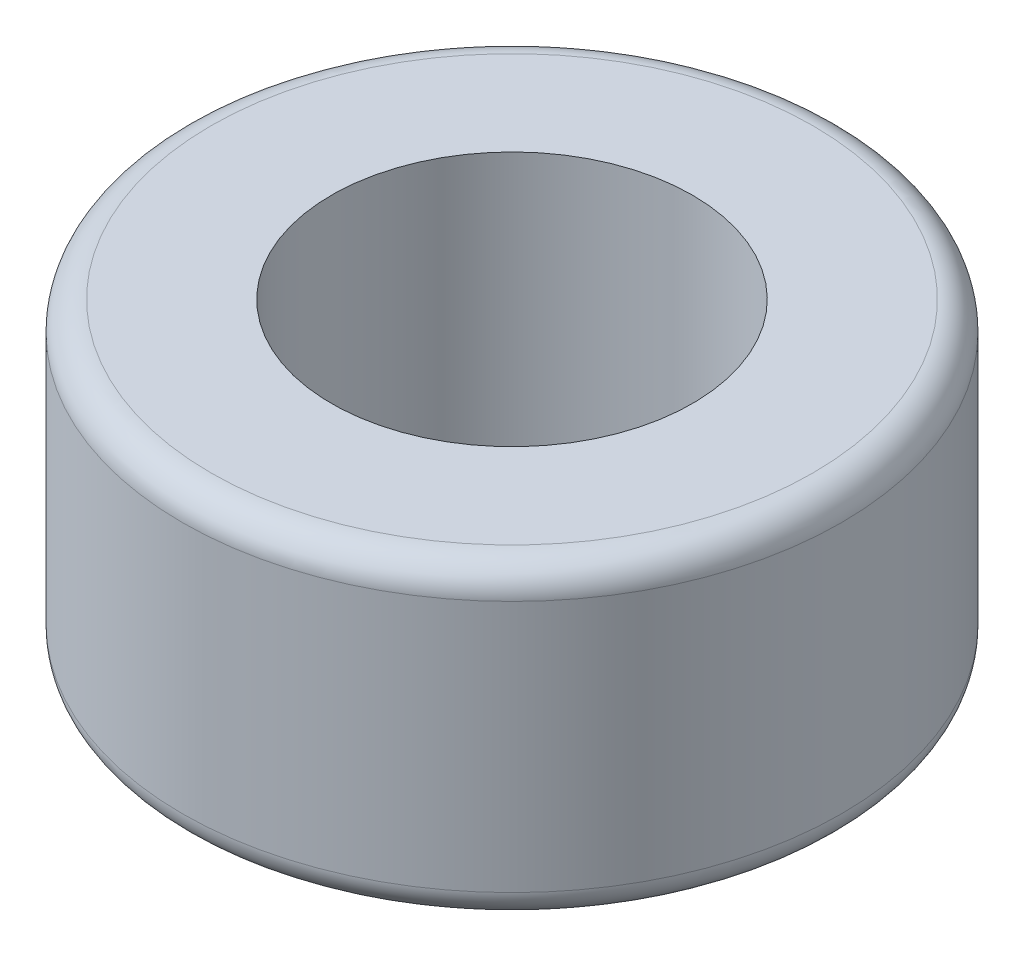
ISO-10303-21;
HEADER;
FILE_DESCRIPTION(('STEP AP214'),'2;1');
FILE_NAME('part.step','',(''),(''),'','','');
FILE_SCHEMA(('AUTOMOTIVE_DESIGN { 1 0 10303 214 1 1 1 1 }'));
ENDSEC;
DATA;
#1=APPLICATION_CONTEXT('core data for automotive mechanical design processes');
#2=APPLICATION_PROTOCOL_DEFINITION('international standard','automotive_design',2000,#1);
#3=PRODUCT_CONTEXT('',#1,'mechanical');
#4=PRODUCT('Part','Part','',(#3));
#5=PRODUCT_RELATED_PRODUCT_CATEGORY('part','',(#4));
#6=PRODUCT_DEFINITION_FORMATION('','',#4);
#7=PRODUCT_DEFINITION_CONTEXT('part definition',#1,'design');
#8=PRODUCT_DEFINITION('design','',#6,#7);
#9=PRODUCT_DEFINITION_SHAPE('','',#8);
#10=(LENGTH_UNIT() NAMED_UNIT(*) SI_UNIT(.MILLI.,.METRE.));
#11=(NAMED_UNIT(*) PLANE_ANGLE_UNIT() SI_UNIT($,.RADIAN.));
#12=(NAMED_UNIT(*) SI_UNIT($,.STERADIAN.) SOLID_ANGLE_UNIT());
#13=UNCERTAINTY_MEASURE_WITH_UNIT(LENGTH_MEASURE(1.E-05),#10,'distance_accuracy_value','');
#14=(GEOMETRIC_REPRESENTATION_CONTEXT(3) GLOBAL_UNCERTAINTY_ASSIGNED_CONTEXT((#13)) GLOBAL_UNIT_ASSIGNED_CONTEXT((#10,
#11,#12)) REPRESENTATION_CONTEXT('',''));
#15=CARTESIAN_POINT('',(0.,0.,0.));
#16=DIRECTION('',(0.,0.,1.));
#17=DIRECTION('',(1.,0.,0.));
#18=AXIS2_PLACEMENT_3D('',#15,#16,#17);
#19=CARTESIAN_POINT('',(0.,0.,0.));
#20=DIRECTION('',(0.,-1.,0.));
#21=DIRECTION('',(0.,0.,-1.));
#22=AXIS2_PLACEMENT_3D('',#19,#20,#21);
#23=CYLINDRICAL_SURFACE('',#22,5.75);
#24=CARTESIAN_POINT('',(0.,-2.2,0.));
#25=DIRECTION('',(0.,1.,0.));
#26=DIRECTION('',(0.,0.,1.));
#27=AXIS2_PLACEMENT_3D('',#24,#25,#26);
#28=CIRCLE('',#27,5.75);
#29=CARTESIAN_POINT('',(0.,-2.2,5.75));
#30=VERTEX_POINT('',#29);
#31=EDGE_CURVE('E37',#30,#30,#28,.T.);
#32=ORIENTED_EDGE('',*,*,#31,.T.);
#33=EDGE_LOOP('',(#32));
#34=FACE_BOUND('',#33,.T.);
#35=CARTESIAN_POINT('',(0.,2.2,0.));
#36=DIRECTION('',(0.,-1.,0.));
#37=DIRECTION('',(0.,0.,-1.));
#38=AXIS2_PLACEMENT_3D('',#35,#36,#37);
#39=CIRCLE('',#38,5.75);
#40=CARTESIAN_POINT('',(0.,2.2,-5.75));
#41=VERTEX_POINT('',#40);
#42=EDGE_CURVE('E41',#41,#41,#39,.T.);
#43=ORIENTED_EDGE('',*,*,#42,.T.);
#44=EDGE_LOOP('',(#43));
#45=FACE_BOUND('',#44,.T.);
#46=ADVANCED_FACE('F30',(#34,#45),#23,.T.);
#47=CARTESIAN_POINT('',(-5.75,-2.7,0.));
#48=DIRECTION('',(0.,1.,0.));
#49=DIRECTION('',(0.,0.,1.));
#50=AXIS2_PLACEMENT_3D('',#47,#48,#49);
#51=PLANE('',#50);
#52=CARTESIAN_POINT('',(0.,-2.7,0.));
#53=DIRECTION('',(0.,1.,0.));
#54=DIRECTION('',(0.,0.,1.));
#55=AXIS2_PLACEMENT_3D('',#52,#53,#54);
#56=CIRCLE('',#55,5.25);
#57=CARTESIAN_POINT('',(0.,-2.7,5.25));
#58=VERTEX_POINT('',#57);
#59=EDGE_CURVE('E45',#58,#58,#56,.F.);
#60=ORIENTED_EDGE('',*,*,#59,.T.);
#61=EDGE_LOOP('',(#60));
#62=FACE_BOUND('',#61,.T.);
#63=CARTESIAN_POINT('',(0.,-2.7,0.));
#64=DIRECTION('',(0.,-1.,0.));
#65=DIRECTION('',(0.,0.,-1.));
#66=AXIS2_PLACEMENT_3D('',#63,#64,#65);
#67=CIRCLE('',#66,3.15);
#68=CARTESIAN_POINT('',(0.,-2.7,-3.15));
#69=VERTEX_POINT('',#68);
#70=EDGE_CURVE('E50',#69,#69,#67,.T.);
#71=ORIENTED_EDGE('',*,*,#70,.F.);
#72=EDGE_LOOP('',(#71));
#73=FACE_BOUND('',#72,.T.);
#74=ADVANCED_FACE('F62',(#62,#73),#51,.F.);
#75=CARTESIAN_POINT('',(0.,0.,0.));
#76=DIRECTION('',(0.,-1.,0.));
#77=DIRECTION('',(0.,0.,-1.));
#78=AXIS2_PLACEMENT_3D('',#75,#76,#77);
#79=CYLINDRICAL_SURFACE('',#78,3.15);
#80=CARTESIAN_POINT('',(0.,2.7,0.));
#81=DIRECTION('',(0.,-1.,0.));
#82=DIRECTION('',(0.,0.,-1.));
#83=AXIS2_PLACEMENT_3D('',#80,#81,#82);
#84=CIRCLE('',#83,3.15);
#85=CARTESIAN_POINT('',(0.,2.7,-3.15));
#86=VERTEX_POINT('',#85);
#87=EDGE_CURVE('E53',#86,#86,#84,.T.);
#88=ORIENTED_EDGE('',*,*,#87,.F.);
#89=EDGE_LOOP('',(#88));
#90=FACE_BOUND('',#89,.T.);
#91=ORIENTED_EDGE('',*,*,#70,.T.);
#92=EDGE_LOOP('',(#91));
#93=FACE_BOUND('',#92,.T.);
#94=ADVANCED_FACE('F59',(#90,#93),#79,.F.);
#95=CARTESIAN_POINT('',(-5.75,2.7,0.));
#96=DIRECTION('',(0.,-1.,0.));
#97=DIRECTION('',(0.,0.,-1.));
#98=AXIS2_PLACEMENT_3D('',#95,#96,#97);
#99=PLANE('',#98);
#100=CARTESIAN_POINT('',(0.,2.7,0.));
#101=DIRECTION('',(0.,-1.,0.));
#102=DIRECTION('',(0.,0.,-1.));
#103=AXIS2_PLACEMENT_3D('',#100,#101,#102);
#104=CIRCLE('',#103,5.25);
#105=CARTESIAN_POINT('',(0.,2.7,-5.25));
#106=VERTEX_POINT('',#105);
#107=EDGE_CURVE('E10',#106,#106,#104,.F.);
#108=ORIENTED_EDGE('',*,*,#107,.T.);
#109=EDGE_LOOP('',(#108));
#110=FACE_BOUND('',#109,.T.);
#111=ORIENTED_EDGE('',*,*,#87,.T.);
#112=EDGE_LOOP('',(#111));
#113=FACE_BOUND('',#112,.T.);
#114=ADVANCED_FACE('F57',(#110,#113),#99,.F.);
#115=CARTESIAN_POINT('',(0.,-2.2,0.));
#116=DIRECTION('',(0.,1.,0.));
#117=DIRECTION('',(0.,0.,1.));
#118=AXIS2_PLACEMENT_3D('',#115,#116,#117);
#119=TOROIDAL_SURFACE('',#118,5.25,0.5);
#120=ORIENTED_EDGE('',*,*,#31,.F.);
#121=EDGE_LOOP('',(#120));
#122=FACE_BOUND('',#121,.T.);
#123=ORIENTED_EDGE('',*,*,#59,.F.);
#124=EDGE_LOOP('',(#123));
#125=FACE_BOUND('',#124,.T.);
#126=ADVANCED_FACE('F74',(#122,#125),#119,.T.);
#127=CARTESIAN_POINT('',(0.,2.2,0.));
#128=DIRECTION('',(0.,-1.,0.));
#129=DIRECTION('',(0.,0.,-1.));
#130=AXIS2_PLACEMENT_3D('',#127,#128,#129);
#131=TOROIDAL_SURFACE('',#130,5.25,0.5);
#132=ORIENTED_EDGE('',*,*,#107,.F.);
#133=EDGE_LOOP('',(#132));
#134=FACE_BOUND('',#133,.T.);
#135=ORIENTED_EDGE('',*,*,#42,.F.);
#136=EDGE_LOOP('',(#135));
#137=FACE_BOUND('',#136,.T.);
#138=ADVANCED_FACE('F32',(#134,#137),#131,.T.);
#139=CLOSED_SHELL('',(#46,#74,#94,#114,#126,#138));
#140=MANIFOLD_SOLID_BREP('B2',#139);
#141=ADVANCED_BREP_SHAPE_REPRESENTATION('',(#18,#140),#14);
#142=SHAPE_DEFINITION_REPRESENTATION(#9,#141);
ENDSEC;
END-ISO-10303-21;
